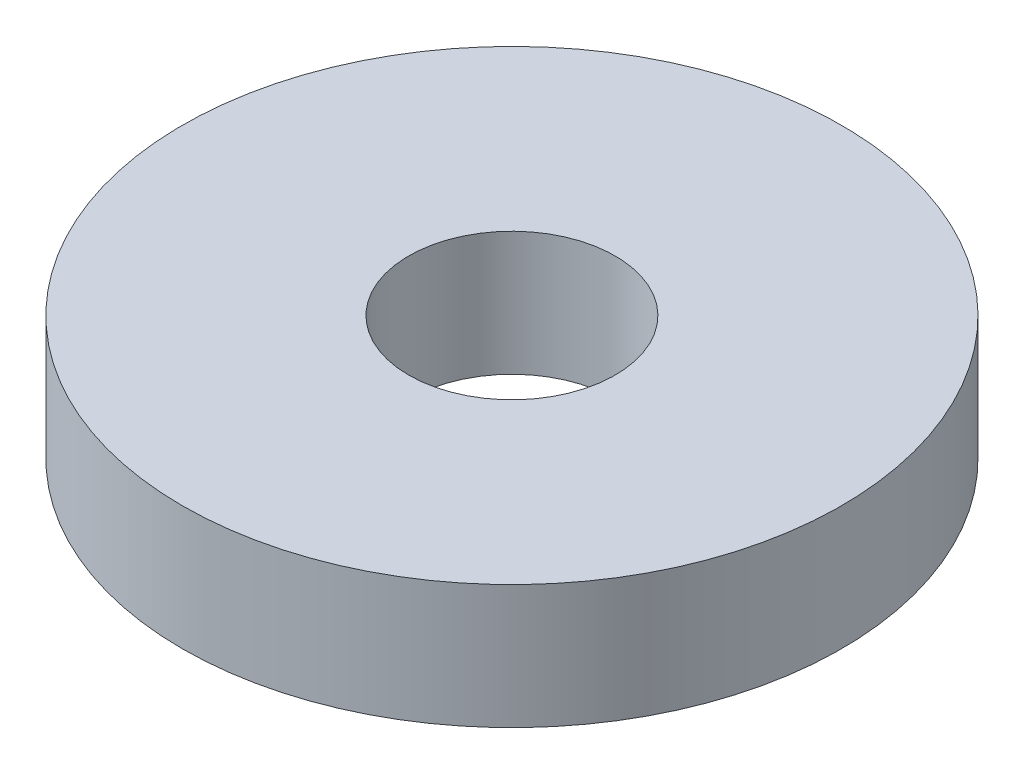
ISO-10303-21;
HEADER;
FILE_DESCRIPTION(('STEP AP214'),'2;1');
FILE_NAME('part.step','',(''),(''),'','','');
FILE_SCHEMA(('AUTOMOTIVE_DESIGN { 1 0 10303 214 1 1 1 1 }'));
ENDSEC;
DATA;
#1=APPLICATION_CONTEXT('core data for automotive mechanical design processes');
#2=APPLICATION_PROTOCOL_DEFINITION('international standard','automotive_design',2000,#1);
#3=PRODUCT_CONTEXT('',#1,'mechanical');
#4=PRODUCT('Part','Part','',(#3));
#5=PRODUCT_RELATED_PRODUCT_CATEGORY('part','',(#4));
#6=PRODUCT_DEFINITION_FORMATION('','',#4);
#7=PRODUCT_DEFINITION_CONTEXT('part definition',#1,'design');
#8=PRODUCT_DEFINITION('design','',#6,#7);
#9=PRODUCT_DEFINITION_SHAPE('','',#8);
#10=(LENGTH_UNIT() NAMED_UNIT(*) SI_UNIT(.MILLI.,.METRE.));
#11=(NAMED_UNIT(*) PLANE_ANGLE_UNIT() SI_UNIT($,.RADIAN.));
#12=(NAMED_UNIT(*) SI_UNIT($,.STERADIAN.) SOLID_ANGLE_UNIT());
#13=UNCERTAINTY_MEASURE_WITH_UNIT(LENGTH_MEASURE(1.E-05),#10,'distance_accuracy_value','');
#14=(GEOMETRIC_REPRESENTATION_CONTEXT(3) GLOBAL_UNCERTAINTY_ASSIGNED_CONTEXT((#13)) GLOBAL_UNIT_ASSIGNED_CONTEXT((#10,
#11,#12)) REPRESENTATION_CONTEXT('',''));
#15=CARTESIAN_POINT('',(0.,0.,0.));
#16=DIRECTION('',(0.,0.,1.));
#17=DIRECTION('',(1.,0.,0.));
#18=AXIS2_PLACEMENT_3D('',#15,#16,#17);
#19=CARTESIAN_POINT('',(0.,3.,0.));
#20=DIRECTION('',(0.,1.,0.));
#21=DIRECTION('',(0.,0.,1.));
#22=AXIS2_PLACEMENT_3D('',#19,#20,#21);
#23=PLANE('',#22);
#24=CARTESIAN_POINT('',(0.,3.,0.));
#25=DIRECTION('',(0.,1.,0.));
#26=DIRECTION('',(0.,0.,1.));
#27=AXIS2_PLACEMENT_3D('',#24,#25,#26);
#28=CIRCLE('',#27,7.98);
#29=CARTESIAN_POINT('',(0.,3.,7.98));
#30=VERTEX_POINT('',#29);
#31=EDGE_CURVE('E10',#30,#30,#28,.T.);
#32=ORIENTED_EDGE('',*,*,#31,.T.);
#33=EDGE_LOOP('',(#32));
#34=FACE_BOUND('',#33,.T.);
#35=CARTESIAN_POINT('',(0.,3.,0.));
#36=DIRECTION('',(0.,1.,0.));
#37=DIRECTION('',(0.,0.,1.));
#38=AXIS2_PLACEMENT_3D('',#35,#36,#37);
#39=CIRCLE('',#38,2.5);
#40=CARTESIAN_POINT('',(0.,3.,2.5));
#41=VERTEX_POINT('',#40);
#42=EDGE_CURVE('E42',#41,#41,#39,.T.);
#43=ORIENTED_EDGE('',*,*,#42,.F.);
#44=EDGE_LOOP('',(#43));
#45=FACE_BOUND('',#44,.T.);
#46=ADVANCED_FACE('F31',(#34,#45),#23,.T.);
#47=CARTESIAN_POINT('',(0.,0.,0.));
#48=DIRECTION('',(0.,1.,0.));
#49=DIRECTION('',(0.,0.,1.));
#50=AXIS2_PLACEMENT_3D('',#47,#48,#49);
#51=PLANE('',#50);
#52=CARTESIAN_POINT('',(0.,0.,0.));
#53=DIRECTION('',(0.,1.,0.));
#54=DIRECTION('',(0.,0.,1.));
#55=AXIS2_PLACEMENT_3D('',#52,#53,#54);
#56=CIRCLE('',#55,7.98);
#57=CARTESIAN_POINT('',(0.,0.,7.98));
#58=VERTEX_POINT('',#57);
#59=EDGE_CURVE('E35',#58,#58,#56,.T.);
#60=ORIENTED_EDGE('',*,*,#59,.F.);
#61=EDGE_LOOP('',(#60));
#62=FACE_BOUND('',#61,.T.);
#63=CARTESIAN_POINT('',(0.,0.,0.));
#64=DIRECTION('',(0.,1.,0.));
#65=DIRECTION('',(0.,0.,1.));
#66=AXIS2_PLACEMENT_3D('',#63,#64,#65);
#67=CIRCLE('',#66,2.5);
#68=CARTESIAN_POINT('',(0.,0.,2.5));
#69=VERTEX_POINT('',#68);
#70=EDGE_CURVE('E44',#69,#69,#67,.T.);
#71=ORIENTED_EDGE('',*,*,#70,.T.);
#72=EDGE_LOOP('',(#71));
#73=FACE_BOUND('',#72,.T.);
#74=ADVANCED_FACE('F54',(#62,#73),#51,.F.);
#75=CARTESIAN_POINT('',(0.,3.,0.));
#76=DIRECTION('',(0.,-1.,0.));
#77=DIRECTION('',(0.,0.,-1.));
#78=AXIS2_PLACEMENT_3D('',#75,#76,#77);
#79=CYLINDRICAL_SURFACE('',#78,7.98);
#80=ORIENTED_EDGE('',*,*,#31,.F.);
#81=EDGE_LOOP('',(#80));
#82=FACE_BOUND('',#81,.T.);
#83=ORIENTED_EDGE('',*,*,#59,.T.);
#84=EDGE_LOOP('',(#83));
#85=FACE_BOUND('',#84,.T.);
#86=ADVANCED_FACE('F33',(#82,#85),#79,.T.);
#87=CARTESIAN_POINT('',(0.,3.,0.));
#88=DIRECTION('',(0.,-1.,0.));
#89=DIRECTION('',(0.,0.,-1.));
#90=AXIS2_PLACEMENT_3D('',#87,#88,#89);
#91=CYLINDRICAL_SURFACE('',#90,2.5);
#92=ORIENTED_EDGE('',*,*,#42,.T.);
#93=EDGE_LOOP('',(#92));
#94=FACE_BOUND('',#93,.T.);
#95=ORIENTED_EDGE('',*,*,#70,.F.);
#96=EDGE_LOOP('',(#95));
#97=FACE_BOUND('',#96,.T.);
#98=ADVANCED_FACE('F50',(#94,#97),#91,.F.);
#99=CLOSED_SHELL('',(#46,#74,#86,#98));
#100=MANIFOLD_SOLID_BREP('B2',#99);
#101=ADVANCED_BREP_SHAPE_REPRESENTATION('',(#18,#100),#14);
#102=SHAPE_DEFINITION_REPRESENTATION(#9,#101);
ENDSEC;
END-ISO-10303-21;
